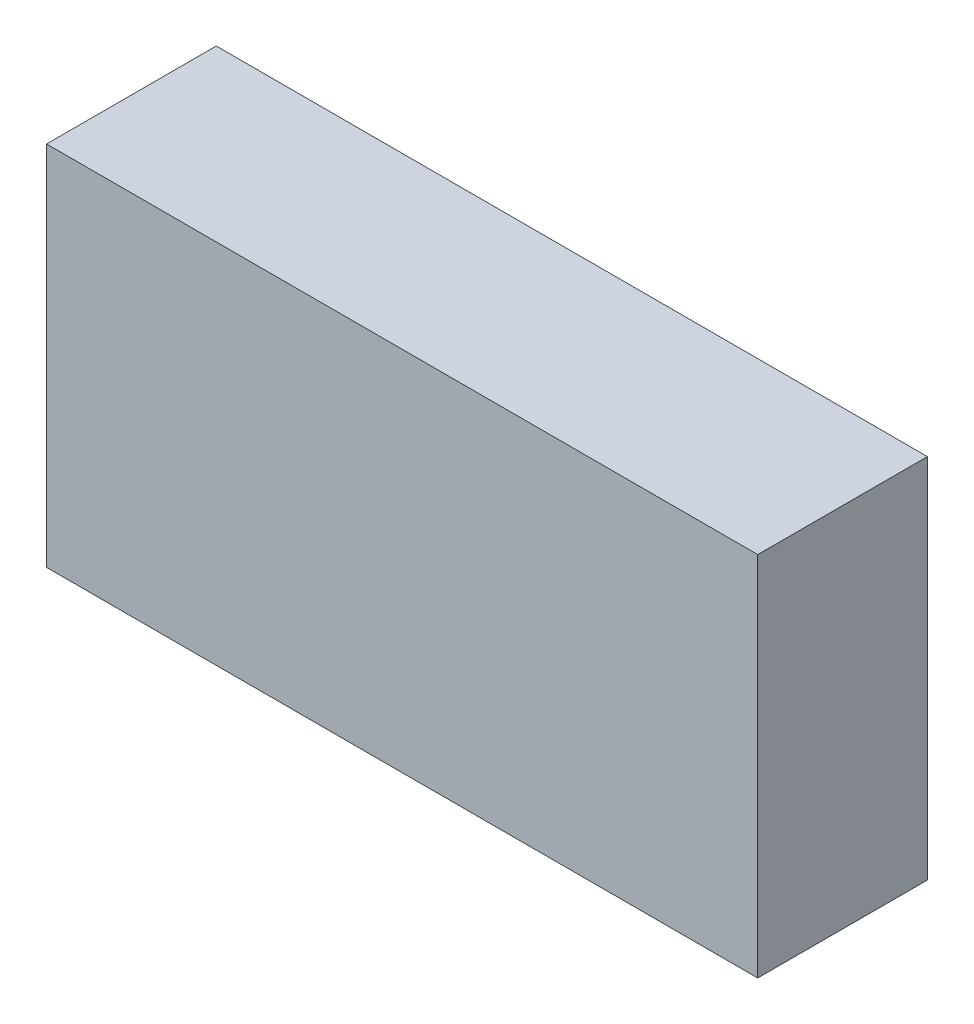
ISO-10303-21;
HEADER;
FILE_DESCRIPTION(('STEP AP214'),'2;1');
FILE_NAME('part.step','',(''),(''),'','','');
FILE_SCHEMA(('AUTOMOTIVE_DESIGN { 1 0 10303 214 1 1 1 1 }'));
ENDSEC;
DATA;
#1=APPLICATION_CONTEXT('core data for automotive mechanical design processes');
#2=APPLICATION_PROTOCOL_DEFINITION('international standard','automotive_design',2000,#1);
#3=PRODUCT_CONTEXT('',#1,'mechanical');
#4=PRODUCT('Part','Part','',(#3));
#5=PRODUCT_RELATED_PRODUCT_CATEGORY('part','',(#4));
#6=PRODUCT_DEFINITION_FORMATION('','',#4);
#7=PRODUCT_DEFINITION_CONTEXT('part definition',#1,'design');
#8=PRODUCT_DEFINITION('design','',#6,#7);
#9=PRODUCT_DEFINITION_SHAPE('','',#8);
#10=(LENGTH_UNIT() NAMED_UNIT(*) SI_UNIT(.MILLI.,.METRE.));
#11=(NAMED_UNIT(*) PLANE_ANGLE_UNIT() SI_UNIT($,.RADIAN.));
#12=(NAMED_UNIT(*) SI_UNIT($,.STERADIAN.) SOLID_ANGLE_UNIT());
#13=UNCERTAINTY_MEASURE_WITH_UNIT(LENGTH_MEASURE(1.E-05),#10,'distance_accuracy_value','');
#14=(GEOMETRIC_REPRESENTATION_CONTEXT(3) GLOBAL_UNCERTAINTY_ASSIGNED_CONTEXT((#13)) GLOBAL_UNIT_ASSIGNED_CONTEXT((#10,
#11,#12)) REPRESENTATION_CONTEXT('',''));
#15=CARTESIAN_POINT('',(0.,0.,0.));
#16=DIRECTION('',(0.,0.,1.));
#17=DIRECTION('',(1.,0.,0.));
#18=AXIS2_PLACEMENT_3D('',#15,#16,#17);
#19=CARTESIAN_POINT('',(-0.8382,-0.432181,0.4));
#20=DIRECTION('',(0.,0.,1.));
#21=DIRECTION('',(1.,0.,0.));
#22=AXIS2_PLACEMENT_3D('',#19,#20,#21);
#23=PLANE('',#22);
#24=DIRECTION('',(0.,1.,0.));
#25=VECTOR('',#24,1.);
#26=CARTESIAN_POINT('',(0.8382,0.432181,0.4));
#27=LINE('',#26,#25);
#28=CARTESIAN_POINT('',(0.8382,0.432181,0.4));
#29=VERTEX_POINT('',#28);
#30=CARTESIAN_POINT('',(0.8382,-0.432181,0.4));
#31=VERTEX_POINT('',#30);
#32=EDGE_CURVE('E58',#29,#31,#27,.F.);
#33=ORIENTED_EDGE('',*,*,#32,.F.);
#34=DIRECTION('',(1.,0.,0.));
#35=VECTOR('',#34,1.);
#36=CARTESIAN_POINT('',(-0.8382,0.432181,0.4));
#37=LINE('',#36,#35);
#38=CARTESIAN_POINT('',(-0.8382,0.432181,0.4));
#39=VERTEX_POINT('',#38);
#40=EDGE_CURVE('E53',#39,#29,#37,.T.);
#41=ORIENTED_EDGE('',*,*,#40,.F.);
#42=DIRECTION('',(0.,1.,0.));
#43=VECTOR('',#42,1.);
#44=CARTESIAN_POINT('',(-0.8382,-0.432181,0.4));
#45=LINE('',#44,#43);
#46=CARTESIAN_POINT('',(-0.8382,-0.432181,0.4));
#47=VERTEX_POINT('',#46);
#48=EDGE_CURVE('E68',#47,#39,#45,.T.);
#49=ORIENTED_EDGE('',*,*,#48,.F.);
#50=DIRECTION('',(1.,0.,0.));
#51=VECTOR('',#50,1.);
#52=CARTESIAN_POINT('',(0.8382,-0.432181,0.4));
#53=LINE('',#52,#51);
#54=EDGE_CURVE('E20',#31,#47,#53,.F.);
#55=ORIENTED_EDGE('',*,*,#54,.F.);
#56=EDGE_LOOP('',(#33,#41,#49,#55));
#57=FACE_BOUND('',#56,.T.);
#58=ADVANCED_FACE('F17',(#57),#23,.T.);
#59=CARTESIAN_POINT('',(0.8382,-0.432181,0.));
#60=DIRECTION('',(0.,-1.,0.));
#61=DIRECTION('',(0.,0.,-1.));
#62=AXIS2_PLACEMENT_3D('',#59,#60,#61);
#63=PLANE('',#62);
#64=DIRECTION('',(0.,0.,1.));
#65=VECTOR('',#64,1.);
#66=CARTESIAN_POINT('',(-0.8382,-0.432181,0.));
#67=LINE('',#66,#65);
#68=CARTESIAN_POINT('',(-0.8382,-0.432181,0.));
#69=VERTEX_POINT('',#68);
#70=EDGE_CURVE('E79',#69,#47,#67,.T.);
#71=ORIENTED_EDGE('',*,*,#70,.F.);
#72=DIRECTION('',(1.,0.,0.));
#73=VECTOR('',#72,1.);
#74=CARTESIAN_POINT('',(-0.8382,-0.432181,0.));
#75=LINE('',#74,#73);
#76=CARTESIAN_POINT('',(0.8382,-0.432181,0.));
#77=VERTEX_POINT('',#76);
#78=EDGE_CURVE('E74',#69,#77,#75,.T.);
#79=ORIENTED_EDGE('',*,*,#78,.T.);
#80=DIRECTION('',(0.,0.,-1.));
#81=VECTOR('',#80,1.);
#82=CARTESIAN_POINT('',(0.8382,-0.432181,0.));
#83=LINE('',#82,#81);
#84=EDGE_CURVE('E63',#31,#77,#83,.T.);
#85=ORIENTED_EDGE('',*,*,#84,.F.);
#86=ORIENTED_EDGE('',*,*,#54,.T.);
#87=EDGE_LOOP('',(#71,#79,#85,#86));
#88=FACE_BOUND('',#87,.T.);
#89=ADVANCED_FACE('F73',(#88),#63,.T.);
#90=CARTESIAN_POINT('',(0.8382,0.432181,0.));
#91=DIRECTION('',(1.,0.,0.));
#92=DIRECTION('',(0.,0.,-1.));
#93=AXIS2_PLACEMENT_3D('',#90,#91,#92);
#94=PLANE('',#93);
#95=ORIENTED_EDGE('',*,*,#84,.T.);
#96=DIRECTION('',(0.,1.,0.));
#97=VECTOR('',#96,1.);
#98=CARTESIAN_POINT('',(0.8382,-0.432181,0.));
#99=LINE('',#98,#97);
#100=CARTESIAN_POINT('',(0.8382,0.432181,0.));
#101=VERTEX_POINT('',#100);
#102=EDGE_CURVE('E84',#77,#101,#99,.T.);
#103=ORIENTED_EDGE('',*,*,#102,.T.);
#104=DIRECTION('',(0.,0.,1.));
#105=VECTOR('',#104,1.);
#106=CARTESIAN_POINT('',(0.8382,0.432181,0.));
#107=LINE('',#106,#105);
#108=EDGE_CURVE('E65',#29,#101,#107,.F.);
#109=ORIENTED_EDGE('',*,*,#108,.F.);
#110=ORIENTED_EDGE('',*,*,#32,.T.);
#111=EDGE_LOOP('',(#95,#103,#109,#110));
#112=FACE_BOUND('',#111,.T.);
#113=ADVANCED_FACE('F60',(#112),#94,.T.);
#114=CARTESIAN_POINT('',(-0.8382,0.432181,0.));
#115=DIRECTION('',(0.,1.,0.));
#116=DIRECTION('',(0.,0.,1.));
#117=AXIS2_PLACEMENT_3D('',#114,#115,#116);
#118=PLANE('',#117);
#119=ORIENTED_EDGE('',*,*,#108,.T.);
#120=DIRECTION('',(1.,0.,0.));
#121=VECTOR('',#120,1.);
#122=CARTESIAN_POINT('',(-0.8382,0.432181,0.));
#123=LINE('',#122,#121);
#124=CARTESIAN_POINT('',(-0.8382,0.432181,0.));
#125=VERTEX_POINT('',#124);
#126=EDGE_CURVE('E26',#101,#125,#123,.F.);
#127=ORIENTED_EDGE('',*,*,#126,.T.);
#128=DIRECTION('',(0.,0.,1.));
#129=VECTOR('',#128,1.);
#130=CARTESIAN_POINT('',(-0.8382,0.432181,0.));
#131=LINE('',#130,#129);
#132=EDGE_CURVE('E34',#39,#125,#131,.F.);
#133=ORIENTED_EDGE('',*,*,#132,.F.);
#134=ORIENTED_EDGE('',*,*,#40,.T.);
#135=EDGE_LOOP('',(#119,#127,#133,#134));
#136=FACE_BOUND('',#135,.T.);
#137=ADVANCED_FACE('F88',(#136),#118,.T.);
#138=CARTESIAN_POINT('',(-0.8382,-0.432181,0.));
#139=DIRECTION('',(-1.,0.,0.));
#140=DIRECTION('',(0.,0.,1.));
#141=AXIS2_PLACEMENT_3D('',#138,#139,#140);
#142=PLANE('',#141);
#143=ORIENTED_EDGE('',*,*,#132,.T.);
#144=DIRECTION('',(0.,1.,0.));
#145=VECTOR('',#144,1.);
#146=CARTESIAN_POINT('',(-0.8382,-0.432181,0.));
#147=LINE('',#146,#145);
#148=EDGE_CURVE('E11',#125,#69,#147,.F.);
#149=ORIENTED_EDGE('',*,*,#148,.T.);
#150=ORIENTED_EDGE('',*,*,#70,.T.);
#151=ORIENTED_EDGE('',*,*,#48,.T.);
#152=EDGE_LOOP('',(#143,#149,#150,#151));
#153=FACE_BOUND('',#152,.T.);
#154=ADVANCED_FACE('F91',(#153),#142,.T.);
#155=CARTESIAN_POINT('',(-0.8382,-0.432181,0.));
#156=DIRECTION('',(0.,0.,1.));
#157=DIRECTION('',(1.,0.,0.));
#158=AXIS2_PLACEMENT_3D('',#155,#156,#157);
#159=PLANE('',#158);
#160=ORIENTED_EDGE('',*,*,#126,.F.);
#161=ORIENTED_EDGE('',*,*,#102,.F.);
#162=ORIENTED_EDGE('',*,*,#78,.F.);
#163=ORIENTED_EDGE('',*,*,#148,.F.);
#164=EDGE_LOOP('',(#160,#161,#162,#163));
#165=FACE_BOUND('',#164,.T.);
#166=ADVANCED_FACE('F90',(#165),#159,.F.);
#167=CLOSED_SHELL('',(#58,#89,#113,#137,#154,#166));
#168=MANIFOLD_SOLID_BREP('B1',#167);
#169=ADVANCED_BREP_SHAPE_REPRESENTATION('',(#18,#168),#14);
#170=SHAPE_DEFINITION_REPRESENTATION(#9,#169);
ENDSEC;
END-ISO-10303-21;
